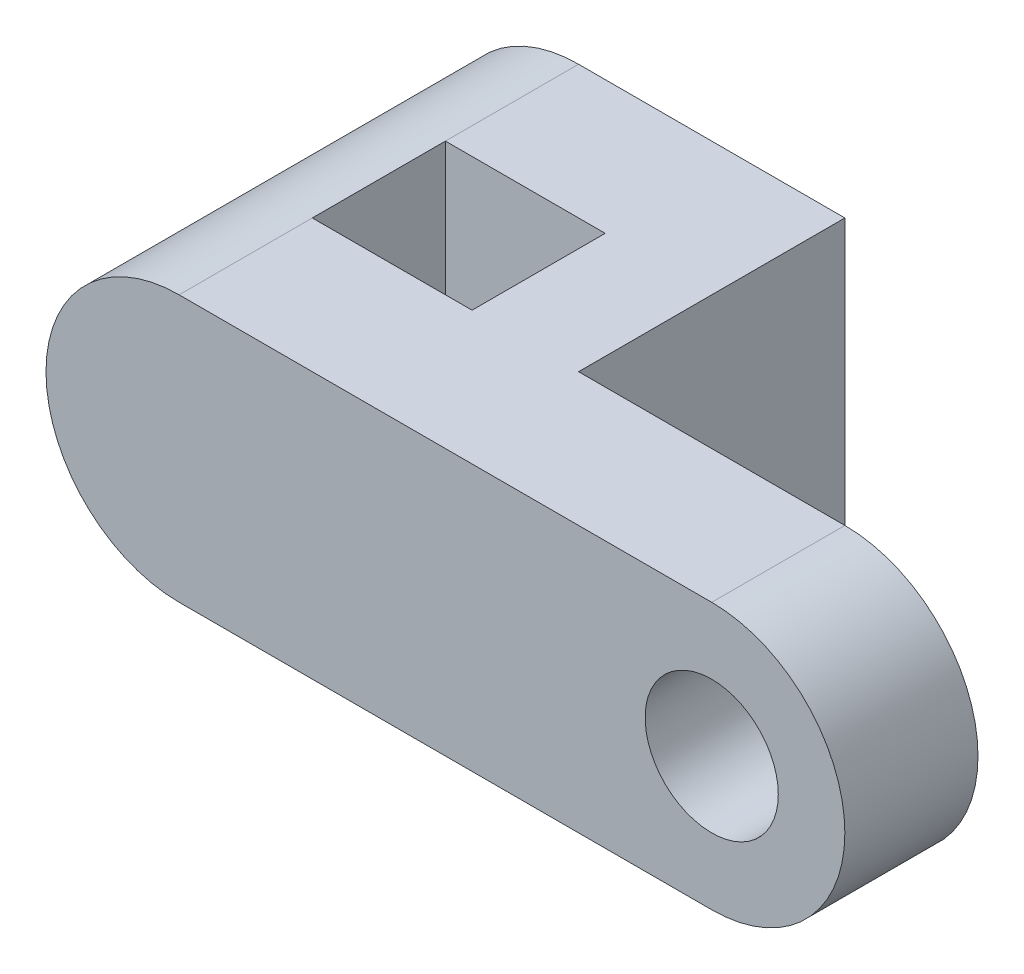
ISO-10303-21;
HEADER;
FILE_DESCRIPTION(('STEP AP214'),'2;1');
FILE_NAME('part.step','',(''),(''),'','','');
FILE_SCHEMA(('AUTOMOTIVE_DESIGN { 1 0 10303 214 1 1 1 1 }'));
ENDSEC;
DATA;
#1=APPLICATION_CONTEXT('core data for automotive mechanical design processes');
#2=APPLICATION_PROTOCOL_DEFINITION('international standard','automotive_design',2000,#1);
#3=PRODUCT_CONTEXT('',#1,'mechanical');
#4=PRODUCT('Part','Part','',(#3));
#5=PRODUCT_RELATED_PRODUCT_CATEGORY('part','',(#4));
#6=PRODUCT_DEFINITION_FORMATION('','',#4);
#7=PRODUCT_DEFINITION_CONTEXT('part definition',#1,'design');
#8=PRODUCT_DEFINITION('design','',#6,#7);
#9=PRODUCT_DEFINITION_SHAPE('','',#8);
#10=(LENGTH_UNIT() NAMED_UNIT(*) SI_UNIT(.MILLI.,.METRE.));
#11=(NAMED_UNIT(*) PLANE_ANGLE_UNIT() SI_UNIT($,.RADIAN.));
#12=(NAMED_UNIT(*) SI_UNIT($,.STERADIAN.) SOLID_ANGLE_UNIT());
#13=UNCERTAINTY_MEASURE_WITH_UNIT(LENGTH_MEASURE(1.E-05),#10,'distance_accuracy_value','');
#14=(GEOMETRIC_REPRESENTATION_CONTEXT(3) GLOBAL_UNCERTAINTY_ASSIGNED_CONTEXT((#13)) GLOBAL_UNIT_ASSIGNED_CONTEXT((#10,
#11,#12)) REPRESENTATION_CONTEXT('',''));
#15=CARTESIAN_POINT('',(0.,0.,0.));
#16=DIRECTION('',(0.,0.,1.));
#17=DIRECTION('',(1.,0.,0.));
#18=AXIS2_PLACEMENT_3D('',#15,#16,#17);
#19=CARTESIAN_POINT('',(0.,0.,5.));
#20=DIRECTION('',(0.,0.,1.));
#21=DIRECTION('',(1.,0.,0.));
#22=AXIS2_PLACEMENT_3D('',#19,#20,#21);
#23=PLANE('',#22);
#24=DIRECTION('',(-1.,0.,0.));
#25=VECTOR('',#24,1.);
#26=CARTESIAN_POINT('',(0.,5.,5.));
#27=LINE('',#26,#25);
#28=CARTESIAN_POINT('',(20.,5.,5.));
#29=VERTEX_POINT('',#28);
#30=CARTESIAN_POINT('',(0.,5.,5.));
#31=VERTEX_POINT('',#30);
#32=EDGE_CURVE('E157',#29,#31,#27,.T.);
#33=ORIENTED_EDGE('',*,*,#32,.T.);
#34=CARTESIAN_POINT('',(0.,0.,5.));
#35=DIRECTION('',(0.,0.,1.));
#36=DIRECTION('',(1.,0.,0.));
#37=AXIS2_PLACEMENT_3D('',#34,#35,#36);
#38=CIRCLE('',#37,5.);
#39=CARTESIAN_POINT('',(0.,-5.,5.));
#40=VERTEX_POINT('',#39);
#41=EDGE_CURVE('E153',#31,#40,#38,.T.);
#42=ORIENTED_EDGE('',*,*,#41,.T.);
#43=DIRECTION('',(1.,0.,0.));
#44=VECTOR('',#43,1.);
#45=CARTESIAN_POINT('',(0.,-5.,5.));
#46=LINE('',#45,#44);
#47=CARTESIAN_POINT('',(20.,-5.,5.));
#48=VERTEX_POINT('',#47);
#49=EDGE_CURVE('E145',#40,#48,#46,.T.);
#50=ORIENTED_EDGE('',*,*,#49,.T.);
#51=CARTESIAN_POINT('',(20.,0.,5.));
#52=DIRECTION('',(0.,0.,1.));
#53=DIRECTION('',(1.,0.,0.));
#54=AXIS2_PLACEMENT_3D('',#51,#52,#53);
#55=CIRCLE('',#54,5.);
#56=EDGE_CURVE('E152',#48,#29,#55,.T.);
#57=ORIENTED_EDGE('',*,*,#56,.T.);
#58=EDGE_LOOP('',(#33,#42,#50,#57));
#59=FACE_BOUND('',#58,.T.);
#60=CARTESIAN_POINT('',(20.,0.,5.));
#61=DIRECTION('',(0.,0.,1.));
#62=DIRECTION('',(1.,0.,0.));
#63=AXIS2_PLACEMENT_3D('',#60,#61,#62);
#64=CIRCLE('',#63,2.5);
#65=CARTESIAN_POINT('',(22.5,0.,5.));
#66=VERTEX_POINT('',#65);
#67=EDGE_CURVE('E178',#66,#66,#64,.T.);
#68=ORIENTED_EDGE('',*,*,#67,.F.);
#69=EDGE_LOOP('',(#68));
#70=FACE_BOUND('',#69,.T.);
#71=ADVANCED_FACE('F39',(#59,#70),#23,.T.);
#72=CARTESIAN_POINT('',(0.,0.,0.));
#73=DIRECTION('',(0.,0.,1.));
#74=DIRECTION('',(1.,0.,0.));
#75=AXIS2_PLACEMENT_3D('',#72,#73,#74);
#76=PLANE('',#75);
#77=DIRECTION('',(1.,0.,0.));
#78=VECTOR('',#77,1.);
#79=CARTESIAN_POINT('',(0.,-5.,0.));
#80=LINE('',#79,#78);
#81=CARTESIAN_POINT('',(10.,-5.,0.));
#82=VERTEX_POINT('',#81);
#83=CARTESIAN_POINT('',(20.,-5.,0.));
#84=VERTEX_POINT('',#83);
#85=EDGE_CURVE('E175',#82,#84,#80,.T.);
#86=ORIENTED_EDGE('',*,*,#85,.F.);
#87=DIRECTION('',(0.,1.,0.));
#88=VECTOR('',#87,1.);
#89=CARTESIAN_POINT('',(10.,0.,0.));
#90=LINE('',#89,#88);
#91=CARTESIAN_POINT('',(10.,5.,0.));
#92=VERTEX_POINT('',#91);
#93=EDGE_CURVE('E218',#82,#92,#90,.T.);
#94=ORIENTED_EDGE('',*,*,#93,.T.);
#95=DIRECTION('',(-1.,0.,0.));
#96=VECTOR('',#95,1.);
#97=CARTESIAN_POINT('',(0.,5.,0.));
#98=LINE('',#97,#96);
#99=CARTESIAN_POINT('',(20.,5.,0.));
#100=VERTEX_POINT('',#99);
#101=EDGE_CURVE('E160',#100,#92,#98,.T.);
#102=ORIENTED_EDGE('',*,*,#101,.F.);
#103=CARTESIAN_POINT('',(20.,0.,0.));
#104=DIRECTION('',(0.,0.,1.));
#105=DIRECTION('',(1.,0.,0.));
#106=AXIS2_PLACEMENT_3D('',#103,#104,#105);
#107=CIRCLE('',#106,5.);
#108=EDGE_CURVE('E164',#84,#100,#107,.T.);
#109=ORIENTED_EDGE('',*,*,#108,.F.);
#110=EDGE_LOOP('',(#86,#94,#102,#109));
#111=FACE_BOUND('',#110,.T.);
#112=CARTESIAN_POINT('',(20.,0.,0.));
#113=DIRECTION('',(0.,0.,1.));
#114=DIRECTION('',(1.,0.,0.));
#115=AXIS2_PLACEMENT_3D('',#112,#113,#114);
#116=CIRCLE('',#115,2.5);
#117=CARTESIAN_POINT('',(22.5,0.,0.));
#118=VERTEX_POINT('',#117);
#119=EDGE_CURVE('E167',#118,#118,#116,.T.);
#120=ORIENTED_EDGE('',*,*,#119,.T.);
#121=EDGE_LOOP('',(#120));
#122=FACE_BOUND('',#121,.T.);
#123=ADVANCED_FACE('F231',(#111,#122),#76,.F.);
#124=CARTESIAN_POINT('',(0.,0.,5.));
#125=DIRECTION('',(0.,0.,-1.));
#126=DIRECTION('',(-1.,0.,0.));
#127=AXIS2_PLACEMENT_3D('',#124,#125,#126);
#128=CYLINDRICAL_SURFACE('',#127,5.);
#129=DIRECTION('',(0.,0.,-1.));
#130=VECTOR('',#129,1.);
#131=CARTESIAN_POINT('',(0.,5.,5.));
#132=LINE('',#131,#130);
#133=CARTESIAN_POINT('',(0.,5.,0.));
#134=VERTEX_POINT('',#133);
#135=EDGE_CURVE('E181',#31,#134,#132,.T.);
#136=ORIENTED_EDGE('',*,*,#135,.T.);
#137=DIRECTION('',(0.,0.,1.));
#138=VECTOR('',#137,1.);
#139=CARTESIAN_POINT('',(0.,5.,-5.));
#140=LINE('',#139,#138);
#141=CARTESIAN_POINT('',(0.,5.,-5.));
#142=VERTEX_POINT('',#141);
#143=EDGE_CURVE('E63',#142,#134,#140,.T.);
#144=ORIENTED_EDGE('',*,*,#143,.F.);
#145=CARTESIAN_POINT('',(0.,5.,-10.));
#146=VERTEX_POINT('',#145);
#147=EDGE_CURVE('E174',#142,#146,#132,.T.);
#148=ORIENTED_EDGE('',*,*,#147,.T.);
#149=CARTESIAN_POINT('',(0.,0.,-10.));
#150=DIRECTION('',(0.,0.,-1.));
#151=DIRECTION('',(-1.,0.,0.));
#152=AXIS2_PLACEMENT_3D('',#149,#150,#151);
#153=CIRCLE('',#152,5.);
#154=CARTESIAN_POINT('',(0.,-5.,-10.));
#155=VERTEX_POINT('',#154);
#156=EDGE_CURVE('E200',#155,#146,#153,.T.);
#157=ORIENTED_EDGE('',*,*,#156,.F.);
#158=DIRECTION('',(0.,0.,-1.));
#159=VECTOR('',#158,1.);
#160=CARTESIAN_POINT('',(0.,-5.,5.));
#161=LINE('',#160,#159);
#162=CARTESIAN_POINT('',(0.,-5.,-5.));
#163=VERTEX_POINT('',#162);
#164=EDGE_CURVE('E48',#163,#155,#161,.T.);
#165=ORIENTED_EDGE('',*,*,#164,.F.);
#166=DIRECTION('',(0.,0.,1.));
#167=VECTOR('',#166,1.);
#168=CARTESIAN_POINT('',(0.,-5.,-5.));
#169=LINE('',#168,#167);
#170=CARTESIAN_POINT('',(0.,-5.,0.));
#171=VERTEX_POINT('',#170);
#172=EDGE_CURVE('E119',#163,#171,#169,.T.);
#173=ORIENTED_EDGE('',*,*,#172,.T.);
#174=EDGE_CURVE('E11',#40,#171,#161,.T.);
#175=ORIENTED_EDGE('',*,*,#174,.F.);
#176=ORIENTED_EDGE('',*,*,#41,.F.);
#177=EDGE_LOOP('',(#136,#144,#148,#157,#165,#173,#175,#176));
#178=FACE_BOUND('',#177,.T.);
#179=ADVANCED_FACE('F41',(#178),#128,.T.);
#180=CARTESIAN_POINT('',(0.,-5.,5.));
#181=DIRECTION('',(0.,1.,0.));
#182=DIRECTION('',(0.,0.,1.));
#183=AXIS2_PLACEMENT_3D('',#180,#181,#182);
#184=PLANE('',#183);
#185=DIRECTION('',(0.,0.,-1.));
#186=VECTOR('',#185,1.);
#187=CARTESIAN_POINT('',(6.,-5.,-5.));
#188=LINE('',#187,#186);
#189=CARTESIAN_POINT('',(6.,-5.,0.));
#190=VERTEX_POINT('',#189);
#191=CARTESIAN_POINT('',(6.,-5.,-5.));
#192=VERTEX_POINT('',#191);
#193=EDGE_CURVE('E55',#190,#192,#188,.T.);
#194=ORIENTED_EDGE('',*,*,#193,.T.);
#195=DIRECTION('',(-1.,0.,0.));
#196=VECTOR('',#195,1.);
#197=CARTESIAN_POINT('',(0.,-5.,-5.));
#198=LINE('',#197,#196);
#199=EDGE_CURVE('E126',#192,#163,#198,.T.);
#200=ORIENTED_EDGE('',*,*,#199,.T.);
#201=ORIENTED_EDGE('',*,*,#164,.T.);
#202=DIRECTION('',(-1.,0.,0.));
#203=VECTOR('',#202,1.);
#204=CARTESIAN_POINT('',(10.,-5.,-10.));
#205=LINE('',#204,#203);
#206=CARTESIAN_POINT('',(10.,-5.,-10.));
#207=VERTEX_POINT('',#206);
#208=EDGE_CURVE('E193',#207,#155,#205,.T.);
#209=ORIENTED_EDGE('',*,*,#208,.F.);
#210=DIRECTION('',(0.,0.,-1.));
#211=VECTOR('',#210,1.);
#212=CARTESIAN_POINT('',(10.,-5.,5.));
#213=LINE('',#212,#211);
#214=EDGE_CURVE('E211',#82,#207,#213,.T.);
#215=ORIENTED_EDGE('',*,*,#214,.F.);
#216=ORIENTED_EDGE('',*,*,#85,.T.);
#217=DIRECTION('',(0.,0.,-1.));
#218=VECTOR('',#217,1.);
#219=CARTESIAN_POINT('',(20.,-5.,5.));
#220=LINE('',#219,#218);
#221=EDGE_CURVE('E148',#48,#84,#220,.T.);
#222=ORIENTED_EDGE('',*,*,#221,.F.);
#223=ORIENTED_EDGE('',*,*,#49,.F.);
#224=ORIENTED_EDGE('',*,*,#174,.T.);
#225=DIRECTION('',(1.,0.,0.));
#226=VECTOR('',#225,1.);
#227=CARTESIAN_POINT('',(0.,-5.,0.));
#228=LINE('',#227,#226);
#229=EDGE_CURVE('E129',#171,#190,#228,.T.);
#230=ORIENTED_EDGE('',*,*,#229,.T.);
#231=EDGE_LOOP('',(#194,#200,#201,#209,#215,#216,#222,#223,#224,#230));
#232=FACE_BOUND('',#231,.T.);
#233=ADVANCED_FACE('F143',(#232),#184,.F.);
#234=CARTESIAN_POINT('',(20.,0.,5.));
#235=DIRECTION('',(0.,0.,-1.));
#236=DIRECTION('',(-1.,0.,0.));
#237=AXIS2_PLACEMENT_3D('',#234,#235,#236);
#238=CYLINDRICAL_SURFACE('',#237,5.);
#239=ORIENTED_EDGE('',*,*,#108,.T.);
#240=DIRECTION('',(0.,0.,-1.));
#241=VECTOR('',#240,1.);
#242=CARTESIAN_POINT('',(20.,5.,5.));
#243=LINE('',#242,#241);
#244=EDGE_CURVE('E184',#29,#100,#243,.T.);
#245=ORIENTED_EDGE('',*,*,#244,.F.);
#246=ORIENTED_EDGE('',*,*,#56,.F.);
#247=ORIENTED_EDGE('',*,*,#221,.T.);
#248=EDGE_LOOP('',(#239,#245,#246,#247));
#249=FACE_BOUND('',#248,.T.);
#250=ADVANCED_FACE('F244',(#249),#238,.T.);
#251=CARTESIAN_POINT('',(0.,5.,5.));
#252=DIRECTION('',(0.,-1.,0.));
#253=DIRECTION('',(0.,0.,-1.));
#254=AXIS2_PLACEMENT_3D('',#251,#252,#253);
#255=PLANE('',#254);
#256=ORIENTED_EDGE('',*,*,#147,.F.);
#257=DIRECTION('',(-1.,0.,0.));
#258=VECTOR('',#257,1.);
#259=CARTESIAN_POINT('',(0.,5.,-5.));
#260=LINE('',#259,#258);
#261=CARTESIAN_POINT('',(6.,5.,-5.));
#262=VERTEX_POINT('',#261);
#263=EDGE_CURVE('E141',#262,#142,#260,.T.);
#264=ORIENTED_EDGE('',*,*,#263,.F.);
#265=DIRECTION('',(0.,0.,-1.));
#266=VECTOR('',#265,1.);
#267=CARTESIAN_POINT('',(6.,5.,-5.));
#268=LINE('',#267,#266);
#269=CARTESIAN_POINT('',(6.,5.,0.));
#270=VERTEX_POINT('',#269);
#271=EDGE_CURVE('E326',#270,#262,#268,.T.);
#272=ORIENTED_EDGE('',*,*,#271,.F.);
#273=DIRECTION('',(1.,0.,0.));
#274=VECTOR('',#273,1.);
#275=CARTESIAN_POINT('',(0.,5.,0.));
#276=LINE('',#275,#274);
#277=EDGE_CURVE('E330',#134,#270,#276,.T.);
#278=ORIENTED_EDGE('',*,*,#277,.F.);
#279=ORIENTED_EDGE('',*,*,#135,.F.);
#280=ORIENTED_EDGE('',*,*,#32,.F.);
#281=ORIENTED_EDGE('',*,*,#244,.T.);
#282=ORIENTED_EDGE('',*,*,#101,.T.);
#283=DIRECTION('',(0.,0.,-1.));
#284=VECTOR('',#283,1.);
#285=CARTESIAN_POINT('',(10.,5.,5.));
#286=LINE('',#285,#284);
#287=CARTESIAN_POINT('',(10.,5.,-10.));
#288=VERTEX_POINT('',#287);
#289=EDGE_CURVE('E215',#92,#288,#286,.T.);
#290=ORIENTED_EDGE('',*,*,#289,.T.);
#291=DIRECTION('',(-1.,0.,0.));
#292=VECTOR('',#291,1.);
#293=CARTESIAN_POINT('',(10.,5.,-10.));
#294=LINE('',#293,#292);
#295=EDGE_CURVE('E208',#288,#146,#294,.T.);
#296=ORIENTED_EDGE('',*,*,#295,.T.);
#297=EDGE_LOOP('',(#256,#264,#272,#278,#279,#280,#281,#282,#290,#296));
#298=FACE_BOUND('',#297,.T.);
#299=ADVANCED_FACE('F236',(#298),#255,.F.);
#300=CARTESIAN_POINT('',(20.,0.,5.));
#301=DIRECTION('',(0.,0.,-1.));
#302=DIRECTION('',(-1.,0.,0.));
#303=AXIS2_PLACEMENT_3D('',#300,#301,#302);
#304=CYLINDRICAL_SURFACE('',#303,2.5);
#305=ORIENTED_EDGE('',*,*,#67,.T.);
#306=EDGE_LOOP('',(#305));
#307=FACE_BOUND('',#306,.T.);
#308=ORIENTED_EDGE('',*,*,#119,.F.);
#309=EDGE_LOOP('',(#308));
#310=FACE_BOUND('',#309,.T.);
#311=ADVANCED_FACE('F233',(#307,#310),#304,.F.);
#312=CARTESIAN_POINT('',(10.,5.,5.));
#313=DIRECTION('',(1.,0.,0.));
#314=DIRECTION('',(0.,0.,-1.));
#315=AXIS2_PLACEMENT_3D('',#312,#313,#314);
#316=PLANE('',#315);
#317=ORIENTED_EDGE('',*,*,#93,.F.);
#318=ORIENTED_EDGE('',*,*,#214,.T.);
#319=DIRECTION('',(0.,-1.,0.));
#320=VECTOR('',#319,1.);
#321=CARTESIAN_POINT('',(10.,5.,-10.));
#322=LINE('',#321,#320);
#323=EDGE_CURVE('E203',#288,#207,#322,.T.);
#324=ORIENTED_EDGE('',*,*,#323,.F.);
#325=ORIENTED_EDGE('',*,*,#289,.F.);
#326=EDGE_LOOP('',(#317,#318,#324,#325));
#327=FACE_BOUND('',#326,.T.);
#328=ADVANCED_FACE('F235',(#327),#316,.T.);
#329=CARTESIAN_POINT('',(0.,0.,-10.));
#330=DIRECTION('',(0.,0.,-1.));
#331=DIRECTION('',(-1.,0.,0.));
#332=AXIS2_PLACEMENT_3D('',#329,#330,#331);
#333=PLANE('',#332);
#334=ORIENTED_EDGE('',*,*,#323,.T.);
#335=ORIENTED_EDGE('',*,*,#208,.T.);
#336=ORIENTED_EDGE('',*,*,#156,.T.);
#337=ORIENTED_EDGE('',*,*,#295,.F.);
#338=EDGE_LOOP('',(#334,#335,#336,#337));
#339=FACE_BOUND('',#338,.T.);
#340=ADVANCED_FACE('F198',(#339),#333,.T.);
#341=CARTESIAN_POINT('',(0.,-5.,-5.));
#342=DIRECTION('',(-1.,0.,0.));
#343=DIRECTION('',(0.,0.,1.));
#344=AXIS2_PLACEMENT_3D('',#341,#342,#343);
#345=PLANE('',#344);
#346=ORIENTED_EDGE('',*,*,#143,.T.);
#347=DIRECTION('',(0.,1.,0.));
#348=VECTOR('',#347,1.);
#349=CARTESIAN_POINT('',(0.,-5.,0.));
#350=LINE('',#349,#348);
#351=EDGE_CURVE('E115',#171,#134,#350,.T.);
#352=ORIENTED_EDGE('',*,*,#351,.F.);
#353=ORIENTED_EDGE('',*,*,#172,.F.);
#354=DIRECTION('',(0.,1.,0.));
#355=VECTOR('',#354,1.);
#356=CARTESIAN_POINT('',(0.,-5.,-5.));
#357=LINE('',#356,#355);
#358=EDGE_CURVE('E337',#163,#142,#357,.T.);
#359=ORIENTED_EDGE('',*,*,#358,.T.);
#360=EDGE_LOOP('',(#346,#352,#353,#359));
#361=FACE_BOUND('',#360,.T.);
#362=ADVANCED_FACE('F117',(#361),#345,.F.);
#363=CARTESIAN_POINT('',(0.,-5.,-5.));
#364=DIRECTION('',(0.,0.,-1.));
#365=DIRECTION('',(-1.,0.,0.));
#366=AXIS2_PLACEMENT_3D('',#363,#364,#365);
#367=PLANE('',#366);
#368=ORIENTED_EDGE('',*,*,#263,.T.);
#369=ORIENTED_EDGE('',*,*,#358,.F.);
#370=ORIENTED_EDGE('',*,*,#199,.F.);
#371=DIRECTION('',(0.,1.,0.));
#372=VECTOR('',#371,1.);
#373=CARTESIAN_POINT('',(6.,-5.,-5.));
#374=LINE('',#373,#372);
#375=EDGE_CURVE('E328',#192,#262,#374,.T.);
#376=ORIENTED_EDGE('',*,*,#375,.T.);
#377=EDGE_LOOP('',(#368,#369,#370,#376));
#378=FACE_BOUND('',#377,.T.);
#379=ADVANCED_FACE('F293',(#378),#367,.F.);
#380=CARTESIAN_POINT('',(6.,-5.,-5.));
#381=DIRECTION('',(1.,0.,0.));
#382=DIRECTION('',(0.,0.,-1.));
#383=AXIS2_PLACEMENT_3D('',#380,#381,#382);
#384=PLANE('',#383);
#385=ORIENTED_EDGE('',*,*,#271,.T.);
#386=ORIENTED_EDGE('',*,*,#375,.F.);
#387=ORIENTED_EDGE('',*,*,#193,.F.);
#388=DIRECTION('',(0.,1.,0.));
#389=VECTOR('',#388,1.);
#390=CARTESIAN_POINT('',(6.,-5.,0.));
#391=LINE('',#390,#389);
#392=EDGE_CURVE('E125',#190,#270,#391,.T.);
#393=ORIENTED_EDGE('',*,*,#392,.T.);
#394=EDGE_LOOP('',(#385,#386,#387,#393));
#395=FACE_BOUND('',#394,.T.);
#396=ADVANCED_FACE('F300',(#395),#384,.F.);
#397=CARTESIAN_POINT('',(0.,-5.,0.));
#398=DIRECTION('',(0.,0.,1.));
#399=DIRECTION('',(1.,0.,0.));
#400=AXIS2_PLACEMENT_3D('',#397,#398,#399);
#401=PLANE('',#400);
#402=ORIENTED_EDGE('',*,*,#277,.T.);
#403=ORIENTED_EDGE('',*,*,#392,.F.);
#404=ORIENTED_EDGE('',*,*,#229,.F.);
#405=ORIENTED_EDGE('',*,*,#351,.T.);
#406=EDGE_LOOP('',(#402,#403,#404,#405));
#407=FACE_BOUND('',#406,.T.);
#408=ADVANCED_FACE('F130',(#407),#401,.F.);
#409=CLOSED_SHELL('',(#71,#123,#179,#233,#250,#299,#311,#328,#340,#362,#379,#396,#408));
#410=MANIFOLD_SOLID_BREP('B2',#409);
#411=ADVANCED_BREP_SHAPE_REPRESENTATION('',(#18,#410),#14);
#412=SHAPE_DEFINITION_REPRESENTATION(#9,#411);
ENDSEC;
END-ISO-10303-21;
